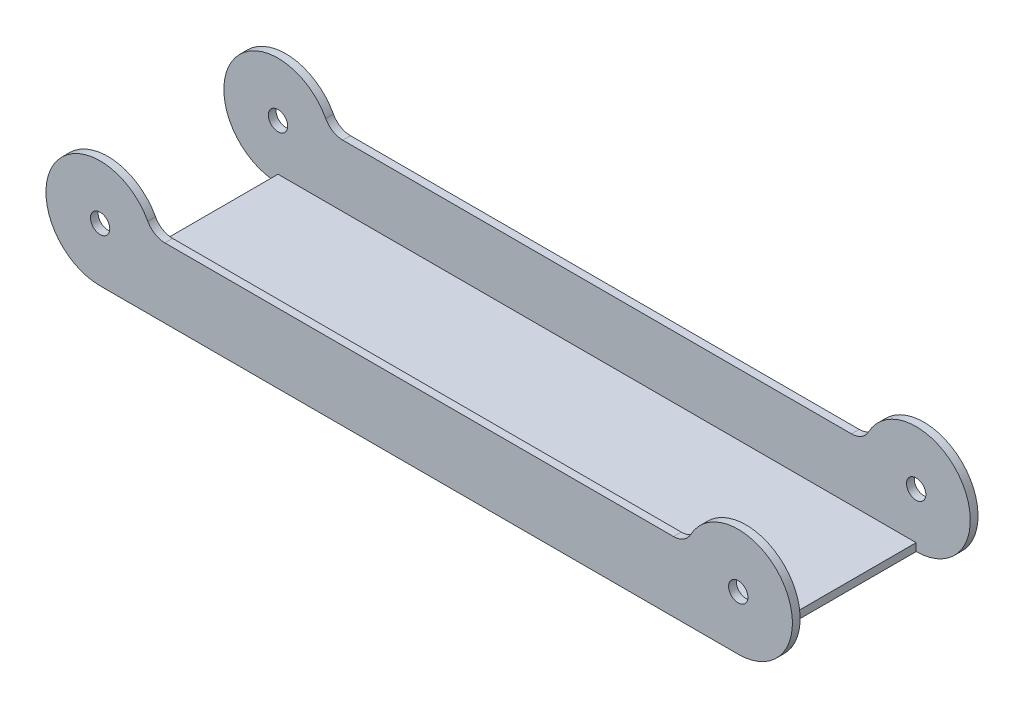
ISO-10303-21;
HEADER;
FILE_DESCRIPTION(('STEP AP214'),'2;1');
FILE_NAME('part.step','',(''),(''),'','','');
FILE_SCHEMA(('AUTOMOTIVE_DESIGN { 1 0 10303 214 1 1 1 1 }'));
ENDSEC;
DATA;
#1=APPLICATION_CONTEXT('core data for automotive mechanical design processes');
#2=APPLICATION_PROTOCOL_DEFINITION('international standard','automotive_design',2000,#1);
#3=PRODUCT_CONTEXT('',#1,'mechanical');
#4=PRODUCT('Part','Part','',(#3));
#5=PRODUCT_RELATED_PRODUCT_CATEGORY('part','',(#4));
#6=PRODUCT_DEFINITION_FORMATION('','',#4);
#7=PRODUCT_DEFINITION_CONTEXT('part definition',#1,'design');
#8=PRODUCT_DEFINITION('design','',#6,#7);
#9=PRODUCT_DEFINITION_SHAPE('','',#8);
#10=(LENGTH_UNIT() NAMED_UNIT(*) SI_UNIT(.MILLI.,.METRE.));
#11=(NAMED_UNIT(*) PLANE_ANGLE_UNIT() SI_UNIT($,.RADIAN.));
#12=(NAMED_UNIT(*) SI_UNIT($,.STERADIAN.) SOLID_ANGLE_UNIT());
#13=UNCERTAINTY_MEASURE_WITH_UNIT(LENGTH_MEASURE(1.E-05),#10,'distance_accuracy_value','');
#14=(GEOMETRIC_REPRESENTATION_CONTEXT(3) GLOBAL_UNCERTAINTY_ASSIGNED_CONTEXT((#13)) GLOBAL_UNIT_ASSIGNED_CONTEXT((#10,
#11,#12)) REPRESENTATION_CONTEXT('',''));
#15=CARTESIAN_POINT('',(0.,0.,0.));
#16=DIRECTION('',(0.,0.,1.));
#17=DIRECTION('',(1.,0.,0.));
#18=AXIS2_PLACEMENT_3D('',#15,#16,#17);
#19=CARTESIAN_POINT('',(82.5,0.,-24.));
#20=DIRECTION('',(0.,0.,1.));
#21=DIRECTION('',(1.,0.,0.));
#22=AXIS2_PLACEMENT_3D('',#19,#20,#21);
#23=CYLINDRICAL_SURFACE('',#22,14.);
#24=CARTESIAN_POINT('',(82.5,0.,-24.));
#25=DIRECTION('',(0.,0.,-1.));
#26=DIRECTION('',(1.,0.,0.));
#27=AXIS2_PLACEMENT_3D('',#24,#25,#26);
#28=CIRCLE('',#27,14.);
#29=CARTESIAN_POINT('',(70.170273293182,6.63157894736842,-24.));
#30=VERTEX_POINT('',#29);
#31=CARTESIAN_POINT('',(82.5,-14.,-24.));
#32=VERTEX_POINT('',#31);
#33=EDGE_CURVE('E276',#30,#32,#28,.T.);
#34=ORIENTED_EDGE('',*,*,#33,.F.);
#35=DIRECTION('',(0.,0.,1.));
#36=VECTOR('',#35,1.);
#37=CARTESIAN_POINT('',(70.170273293182,6.63157894736842,-24.));
#38=LINE('',#37,#36);
#39=CARTESIAN_POINT('',(70.170273293182,6.63157894736842,-22.));
#40=VERTEX_POINT('',#39);
#41=EDGE_CURVE('E139',#30,#40,#38,.T.);
#42=ORIENTED_EDGE('',*,*,#41,.T.);
#43=CARTESIAN_POINT('',(82.5,0.,-22.));
#44=DIRECTION('',(0.,0.,1.));
#45=DIRECTION('',(1.,0.,0.));
#46=AXIS2_PLACEMENT_3D('',#43,#44,#45);
#47=CIRCLE('',#46,14.);
#48=CARTESIAN_POINT('',(82.5,-14.,-22.));
#49=VERTEX_POINT('',#48);
#50=EDGE_CURVE('E132',#40,#49,#47,.F.);
#51=ORIENTED_EDGE('',*,*,#50,.T.);
#52=DIRECTION('',(0.,0.,1.));
#53=VECTOR('',#52,1.);
#54=CARTESIAN_POINT('',(82.5,-14.,-24.));
#55=LINE('',#54,#53);
#56=EDGE_CURVE('E136',#32,#49,#55,.T.);
#57=ORIENTED_EDGE('',*,*,#56,.F.);
#58=EDGE_LOOP('',(#34,#42,#51,#57));
#59=FACE_BOUND('',#58,.T.);
#60=ADVANCED_FACE('F32',(#59),#23,.T.);
#61=CARTESIAN_POINT('',(-82.5,0.,-24.));
#62=DIRECTION('',(0.,0.,1.));
#63=DIRECTION('',(1.,0.,0.));
#64=AXIS2_PLACEMENT_3D('',#61,#62,#63);
#65=CYLINDRICAL_SURFACE('',#64,14.);
#66=CARTESIAN_POINT('',(-82.5,0.,24.));
#67=DIRECTION('',(0.,0.,-1.));
#68=DIRECTION('',(1.,0.,0.));
#69=AXIS2_PLACEMENT_3D('',#66,#67,#68);
#70=CIRCLE('',#69,14.);
#71=CARTESIAN_POINT('',(-82.5,-14.,24.));
#72=VERTEX_POINT('',#71);
#73=CARTESIAN_POINT('',(-70.170273293182,6.63157894736842,24.));
#74=VERTEX_POINT('',#73);
#75=EDGE_CURVE('E269',#72,#74,#70,.T.);
#76=ORIENTED_EDGE('',*,*,#75,.T.);
#77=DIRECTION('',(0.,0.,1.));
#78=VECTOR('',#77,1.);
#79=CARTESIAN_POINT('',(-70.170273293182,6.63157894736842,-24.));
#80=LINE('',#79,#78);
#81=CARTESIAN_POINT('',(-70.170273293182,6.63157894736842,22.));
#82=VERTEX_POINT('',#81);
#83=EDGE_CURVE('E234',#74,#82,#80,.F.);
#84=ORIENTED_EDGE('',*,*,#83,.T.);
#85=CARTESIAN_POINT('',(-82.5,0.,22.));
#86=DIRECTION('',(0.,0.,-1.));
#87=DIRECTION('',(-1.,0.,0.));
#88=AXIS2_PLACEMENT_3D('',#85,#86,#87);
#89=CIRCLE('',#88,14.);
#90=CARTESIAN_POINT('',(-82.5,-14.,22.));
#91=VERTEX_POINT('',#90);
#92=EDGE_CURVE('E177',#82,#91,#89,.F.);
#93=ORIENTED_EDGE('',*,*,#92,.T.);
#94=DIRECTION('',(0.,0.,1.));
#95=VECTOR('',#94,1.);
#96=CARTESIAN_POINT('',(-82.5,-14.,-24.));
#97=LINE('',#96,#95);
#98=EDGE_CURVE('E169',#91,#72,#97,.T.);
#99=ORIENTED_EDGE('',*,*,#98,.T.);
#100=EDGE_LOOP('',(#76,#84,#93,#99));
#101=FACE_BOUND('',#100,.T.);
#102=ADVANCED_FACE('F273',(#101),#65,.T.);
#103=CARTESIAN_POINT('',(0.,-14.,0.));
#104=DIRECTION('',(0.,1.,0.));
#105=DIRECTION('',(0.,0.,1.));
#106=AXIS2_PLACEMENT_3D('',#103,#104,#105);
#107=PLANE('',#106);
#108=ORIENTED_EDGE('',*,*,#56,.T.);
#109=DIRECTION('',(0.,0.,-1.));
#110=VECTOR('',#109,1.);
#111=CARTESIAN_POINT('',(82.5,-14.,22.));
#112=LINE('',#111,#110);
#113=CARTESIAN_POINT('',(82.5,-14.,22.));
#114=VERTEX_POINT('',#113);
#115=EDGE_CURVE('E158',#114,#49,#112,.T.);
#116=ORIENTED_EDGE('',*,*,#115,.F.);
#117=CARTESIAN_POINT('',(82.5,-14.,24.));
#118=VERTEX_POINT('',#117);
#119=EDGE_CURVE('E170',#114,#118,#55,.T.);
#120=ORIENTED_EDGE('',*,*,#119,.T.);
#121=DIRECTION('',(1.,0.,0.));
#122=VECTOR('',#121,1.);
#123=CARTESIAN_POINT('',(-97.5,-14.,24.));
#124=LINE('',#123,#122);
#125=EDGE_CURVE('E210',#72,#118,#124,.T.);
#126=ORIENTED_EDGE('',*,*,#125,.F.);
#127=ORIENTED_EDGE('',*,*,#98,.F.);
#128=DIRECTION('',(0.,0.,1.));
#129=VECTOR('',#128,1.);
#130=CARTESIAN_POINT('',(-82.5,-14.,22.));
#131=LINE('',#130,#129);
#132=CARTESIAN_POINT('',(-82.5,-14.,-22.));
#133=VERTEX_POINT('',#132);
#134=EDGE_CURVE('E323',#133,#91,#131,.T.);
#135=ORIENTED_EDGE('',*,*,#134,.F.);
#136=CARTESIAN_POINT('',(-82.5,-14.,-24.));
#137=VERTEX_POINT('',#136);
#138=EDGE_CURVE('E172',#137,#133,#97,.T.);
#139=ORIENTED_EDGE('',*,*,#138,.F.);
#140=DIRECTION('',(-1.,0.,0.));
#141=VECTOR('',#140,1.);
#142=CARTESIAN_POINT('',(-97.5,-14.,-24.));
#143=LINE('',#142,#141);
#144=EDGE_CURVE('E168',#32,#137,#143,.T.);
#145=ORIENTED_EDGE('',*,*,#144,.F.);
#146=EDGE_LOOP('',(#108,#116,#120,#126,#127,#135,#139,#145));
#147=FACE_BOUND('',#146,.T.);
#148=ADVANCED_FACE('F165',(#147),#107,.F.);
#149=CARTESIAN_POINT('',(-97.5,14.,-24.));
#150=DIRECTION('',(0.,0.,1.));
#151=DIRECTION('',(1.,0.,0.));
#152=AXIS2_PLACEMENT_3D('',#149,#150,#151);
#153=PLANE('',#152);
#154=CARTESIAN_POINT('',(-82.5,0.,-24.));
#155=DIRECTION('',(0.,0.,1.));
#156=DIRECTION('',(1.,0.,0.));
#157=AXIS2_PLACEMENT_3D('',#154,#155,#156);
#158=CIRCLE('',#157,2.49999999999999);
#159=CARTESIAN_POINT('',(-80.,0.,-24.));
#160=VERTEX_POINT('',#159);
#161=EDGE_CURVE('E186',#160,#160,#158,.T.);
#162=ORIENTED_EDGE('',*,*,#161,.T.);
#163=EDGE_LOOP('',(#162));
#164=FACE_BOUND('',#163,.T.);
#165=CARTESIAN_POINT('',(82.5,0.,-24.));
#166=DIRECTION('',(0.,0.,1.));
#167=DIRECTION('',(1.,0.,0.));
#168=AXIS2_PLACEMENT_3D('',#165,#166,#167);
#169=CIRCLE('',#168,2.49999999999999);
#170=CARTESIAN_POINT('',(85.,0.,-24.));
#171=VERTEX_POINT('',#170);
#172=EDGE_CURVE('E193',#171,#171,#169,.T.);
#173=ORIENTED_EDGE('',*,*,#172,.T.);
#174=EDGE_LOOP('',(#173));
#175=FACE_BOUND('',#174,.T.);
#176=CARTESIAN_POINT('',(-82.5,0.,-24.));
#177=DIRECTION('',(0.,0.,-1.));
#178=DIRECTION('',(1.,0.,0.));
#179=AXIS2_PLACEMENT_3D('',#176,#177,#178);
#180=CIRCLE('',#179,14.);
#181=CARTESIAN_POINT('',(-70.170273293182,6.63157894736842,-24.));
#182=VERTEX_POINT('',#181);
#183=EDGE_CURVE('E282',#137,#182,#180,.T.);
#184=ORIENTED_EDGE('',*,*,#183,.T.);
#185=CARTESIAN_POINT('',(-65.7667994693185,9.,-24.));
#186=DIRECTION('',(0.,0.,1.));
#187=DIRECTION('',(1.,0.,0.));
#188=AXIS2_PLACEMENT_3D('',#185,#186,#187);
#189=CIRCLE('',#188,5.);
#190=CARTESIAN_POINT('',(-65.7667994693185,4.,-24.));
#191=VERTEX_POINT('',#190);
#192=EDGE_CURVE('E11',#182,#191,#189,.T.);
#193=ORIENTED_EDGE('',*,*,#192,.T.);
#194=DIRECTION('',(1.,0.,0.));
#195=VECTOR('',#194,1.);
#196=CARTESIAN_POINT('',(-69.0835921350013,4.,-24.));
#197=LINE('',#196,#195);
#198=CARTESIAN_POINT('',(65.7667994693185,4.,-24.));
#199=VERTEX_POINT('',#198);
#200=EDGE_CURVE('E174',#191,#199,#197,.T.);
#201=ORIENTED_EDGE('',*,*,#200,.T.);
#202=CARTESIAN_POINT('',(65.7667994693185,9.,-24.));
#203=DIRECTION('',(0.,0.,1.));
#204=DIRECTION('',(1.,0.,0.));
#205=AXIS2_PLACEMENT_3D('',#202,#203,#204);
#206=CIRCLE('',#205,5.);
#207=EDGE_CURVE('E239',#199,#30,#206,.T.);
#208=ORIENTED_EDGE('',*,*,#207,.T.);
#209=ORIENTED_EDGE('',*,*,#33,.T.);
#210=ORIENTED_EDGE('',*,*,#144,.T.);
#211=EDGE_LOOP('',(#184,#193,#201,#208,#209,#210));
#212=FACE_BOUND('',#211,.T.);
#213=ADVANCED_FACE('F287',(#164,#175,#212),#153,.F.);
#214=CARTESIAN_POINT('',(-97.5,14.,24.));
#215=DIRECTION('',(0.,0.,-1.));
#216=DIRECTION('',(-1.,0.,0.));
#217=AXIS2_PLACEMENT_3D('',#214,#215,#216);
#218=PLANE('',#217);
#219=CARTESIAN_POINT('',(-82.5,0.,24.));
#220=DIRECTION('',(0.,0.,1.));
#221=DIRECTION('',(1.,0.,0.));
#222=AXIS2_PLACEMENT_3D('',#219,#220,#221);
#223=CIRCLE('',#222,2.49999999999999);
#224=CARTESIAN_POINT('',(-80.,0.,24.));
#225=VERTEX_POINT('',#224);
#226=EDGE_CURVE('E190',#225,#225,#223,.T.);
#227=ORIENTED_EDGE('',*,*,#226,.F.);
#228=EDGE_LOOP('',(#227));
#229=FACE_BOUND('',#228,.T.);
#230=CARTESIAN_POINT('',(82.5,0.,24.));
#231=DIRECTION('',(0.,0.,1.));
#232=DIRECTION('',(1.,0.,0.));
#233=AXIS2_PLACEMENT_3D('',#230,#231,#232);
#234=CIRCLE('',#233,2.49999999999999);
#235=CARTESIAN_POINT('',(85.,0.,24.));
#236=VERTEX_POINT('',#235);
#237=EDGE_CURVE('E185',#236,#236,#234,.T.);
#238=ORIENTED_EDGE('',*,*,#237,.F.);
#239=EDGE_LOOP('',(#238));
#240=FACE_BOUND('',#239,.T.);
#241=ORIENTED_EDGE('',*,*,#125,.T.);
#242=CARTESIAN_POINT('',(82.5,0.,24.));
#243=DIRECTION('',(0.,0.,-1.));
#244=DIRECTION('',(1.,0.,0.));
#245=AXIS2_PLACEMENT_3D('',#242,#243,#244);
#246=CIRCLE('',#245,14.);
#247=CARTESIAN_POINT('',(70.170273293182,6.63157894736842,24.));
#248=VERTEX_POINT('',#247);
#249=EDGE_CURVE('E153',#248,#118,#246,.T.);
#250=ORIENTED_EDGE('',*,*,#249,.F.);
#251=CARTESIAN_POINT('',(65.7667994693185,9.,24.));
#252=DIRECTION('',(0.,0.,-1.));
#253=DIRECTION('',(-1.,0.,0.));
#254=AXIS2_PLACEMENT_3D('',#251,#252,#253);
#255=CIRCLE('',#254,5.);
#256=CARTESIAN_POINT('',(65.7667994693185,4.,24.));
#257=VERTEX_POINT('',#256);
#258=EDGE_CURVE('E241',#248,#257,#255,.T.);
#259=ORIENTED_EDGE('',*,*,#258,.T.);
#260=DIRECTION('',(1.,0.,0.));
#261=VECTOR('',#260,1.);
#262=CARTESIAN_POINT('',(-69.0835921350013,4.,24.));
#263=LINE('',#262,#261);
#264=CARTESIAN_POINT('',(-65.7667994693185,4.,24.));
#265=VERTEX_POINT('',#264);
#266=EDGE_CURVE('E271',#265,#257,#263,.T.);
#267=ORIENTED_EDGE('',*,*,#266,.F.);
#268=CARTESIAN_POINT('',(-65.7667994693185,9.,24.));
#269=DIRECTION('',(0.,0.,-1.));
#270=DIRECTION('',(-1.,0.,0.));
#271=AXIS2_PLACEMENT_3D('',#268,#269,#270);
#272=CIRCLE('',#271,5.);
#273=EDGE_CURVE('E245',#265,#74,#272,.T.);
#274=ORIENTED_EDGE('',*,*,#273,.T.);
#275=ORIENTED_EDGE('',*,*,#75,.F.);
#276=EDGE_LOOP('',(#241,#250,#259,#267,#274,#275));
#277=FACE_BOUND('',#276,.T.);
#278=ADVANCED_FACE('F268',(#229,#240,#277),#218,.F.);
#279=CARTESIAN_POINT('',(-97.5,14.,-22.));
#280=DIRECTION('',(0.,0.,1.));
#281=DIRECTION('',(1.,0.,0.));
#282=AXIS2_PLACEMENT_3D('',#279,#280,#281);
#283=PLANE('',#282);
#284=DIRECTION('',(-1.,0.,0.));
#285=VECTOR('',#284,1.);
#286=CARTESIAN_POINT('',(-97.5,-12.,-22.));
#287=LINE('',#286,#285);
#288=CARTESIAN_POINT('',(82.5,-12.,-22.));
#289=VERTEX_POINT('',#288);
#290=CARTESIAN_POINT('',(-82.5,-12.,-22.));
#291=VERTEX_POINT('',#290);
#292=EDGE_CURVE('E149',#289,#291,#287,.T.);
#293=ORIENTED_EDGE('',*,*,#292,.F.);
#294=DIRECTION('',(0.,-1.,0.));
#295=VECTOR('',#294,1.);
#296=CARTESIAN_POINT('',(82.5,14.001,-22.));
#297=LINE('',#296,#295);
#298=EDGE_CURVE('E144',#289,#49,#297,.T.);
#299=ORIENTED_EDGE('',*,*,#298,.T.);
#300=ORIENTED_EDGE('',*,*,#50,.F.);
#301=CARTESIAN_POINT('',(65.7667994693185,9.,-22.));
#302=DIRECTION('',(0.,0.,1.));
#303=DIRECTION('',(1.,0.,0.));
#304=AXIS2_PLACEMENT_3D('',#301,#302,#303);
#305=CIRCLE('',#304,5.);
#306=CARTESIAN_POINT('',(65.7667994693185,4.,-22.));
#307=VERTEX_POINT('',#306);
#308=EDGE_CURVE('E237',#40,#307,#305,.F.);
#309=ORIENTED_EDGE('',*,*,#308,.T.);
#310=DIRECTION('',(1.,0.,0.));
#311=VECTOR('',#310,1.);
#312=CARTESIAN_POINT('',(-97.5,4.,-22.));
#313=LINE('',#312,#311);
#314=CARTESIAN_POINT('',(-65.7667994693185,4.,-22.));
#315=VERTEX_POINT('',#314);
#316=EDGE_CURVE('E140',#315,#307,#313,.T.);
#317=ORIENTED_EDGE('',*,*,#316,.F.);
#318=CARTESIAN_POINT('',(-65.7667994693185,9.,-22.));
#319=DIRECTION('',(0.,0.,1.));
#320=DIRECTION('',(1.,0.,0.));
#321=AXIS2_PLACEMENT_3D('',#318,#319,#320);
#322=CIRCLE('',#321,5.);
#323=CARTESIAN_POINT('',(-70.170273293182,6.63157894736842,-22.));
#324=VERTEX_POINT('',#323);
#325=EDGE_CURVE('E40',#315,#324,#322,.F.);
#326=ORIENTED_EDGE('',*,*,#325,.T.);
#327=CARTESIAN_POINT('',(-82.5,0.,-22.));
#328=DIRECTION('',(0.,0.,1.));
#329=DIRECTION('',(1.,0.,0.));
#330=AXIS2_PLACEMENT_3D('',#327,#328,#329);
#331=CIRCLE('',#330,14.);
#332=EDGE_CURVE('E179',#133,#324,#331,.F.);
#333=ORIENTED_EDGE('',*,*,#332,.F.);
#334=DIRECTION('',(0.,-1.,0.));
#335=VECTOR('',#334,1.);
#336=CARTESIAN_POINT('',(-82.5,14.001,-22.));
#337=LINE('',#336,#335);
#338=EDGE_CURVE('E327',#291,#133,#337,.T.);
#339=ORIENTED_EDGE('',*,*,#338,.F.);
#340=EDGE_LOOP('',(#293,#299,#300,#309,#317,#326,#333,#339));
#341=FACE_BOUND('',#340,.T.);
#342=CARTESIAN_POINT('',(-82.5,0.,-22.));
#343=DIRECTION('',(0.,0.,1.));
#344=DIRECTION('',(1.,0.,0.));
#345=AXIS2_PLACEMENT_3D('',#342,#343,#344);
#346=CIRCLE('',#345,2.49999999999999);
#347=CARTESIAN_POINT('',(-80.,0.,-22.));
#348=VERTEX_POINT('',#347);
#349=EDGE_CURVE('E202',#348,#348,#346,.T.);
#350=ORIENTED_EDGE('',*,*,#349,.F.);
#351=EDGE_LOOP('',(#350));
#352=FACE_BOUND('',#351,.T.);
#353=CARTESIAN_POINT('',(82.5,0.,-22.));
#354=DIRECTION('',(0.,0.,1.));
#355=DIRECTION('',(1.,0.,0.));
#356=AXIS2_PLACEMENT_3D('',#353,#354,#355);
#357=CIRCLE('',#356,2.49999999999999);
#358=CARTESIAN_POINT('',(85.,0.,-22.));
#359=VERTEX_POINT('',#358);
#360=EDGE_CURVE('E198',#359,#359,#357,.T.);
#361=ORIENTED_EDGE('',*,*,#360,.F.);
#362=EDGE_LOOP('',(#361));
#363=FACE_BOUND('',#362,.T.);
#364=ADVANCED_FACE('F146',(#341,#352,#363),#283,.T.);
#365=CARTESIAN_POINT('',(-97.5,14.,22.));
#366=DIRECTION('',(0.,0.,-1.));
#367=DIRECTION('',(-1.,0.,0.));
#368=AXIS2_PLACEMENT_3D('',#365,#366,#367);
#369=PLANE('',#368);
#370=CARTESIAN_POINT('',(82.5,0.,22.));
#371=DIRECTION('',(0.,0.,-1.));
#372=DIRECTION('',(-1.,0.,0.));
#373=AXIS2_PLACEMENT_3D('',#370,#371,#372);
#374=CIRCLE('',#373,14.);
#375=CARTESIAN_POINT('',(70.170273293182,6.63157894736842,22.));
#376=VERTEX_POINT('',#375);
#377=EDGE_CURVE('E141',#114,#376,#374,.F.);
#378=ORIENTED_EDGE('',*,*,#377,.F.);
#379=DIRECTION('',(0.,-1.,0.));
#380=VECTOR('',#379,1.);
#381=CARTESIAN_POINT('',(82.5,14.001,22.));
#382=LINE('',#381,#380);
#383=CARTESIAN_POINT('',(82.5,-12.,22.));
#384=VERTEX_POINT('',#383);
#385=EDGE_CURVE('E154',#384,#114,#382,.T.);
#386=ORIENTED_EDGE('',*,*,#385,.F.);
#387=DIRECTION('',(1.,0.,0.));
#388=VECTOR('',#387,1.);
#389=CARTESIAN_POINT('',(-97.5,-12.,22.));
#390=LINE('',#389,#388);
#391=CARTESIAN_POINT('',(-82.5,-12.,22.));
#392=VERTEX_POINT('',#391);
#393=EDGE_CURVE('E206',#392,#384,#390,.T.);
#394=ORIENTED_EDGE('',*,*,#393,.F.);
#395=DIRECTION('',(0.,-1.,0.));
#396=VECTOR('',#395,1.);
#397=CARTESIAN_POINT('',(-82.5,14.001,22.));
#398=LINE('',#397,#396);
#399=EDGE_CURVE('E333',#392,#91,#398,.T.);
#400=ORIENTED_EDGE('',*,*,#399,.T.);
#401=ORIENTED_EDGE('',*,*,#92,.F.);
#402=CARTESIAN_POINT('',(-65.7667994693185,9.,22.));
#403=DIRECTION('',(0.,0.,-1.));
#404=DIRECTION('',(-1.,0.,0.));
#405=AXIS2_PLACEMENT_3D('',#402,#403,#404);
#406=CIRCLE('',#405,5.);
#407=CARTESIAN_POINT('',(-65.7667994693185,4.,22.));
#408=VERTEX_POINT('',#407);
#409=EDGE_CURVE('E247',#82,#408,#406,.F.);
#410=ORIENTED_EDGE('',*,*,#409,.T.);
#411=DIRECTION('',(-1.,0.,0.));
#412=VECTOR('',#411,1.);
#413=CARTESIAN_POINT('',(-97.5,4.,22.));
#414=LINE('',#413,#412);
#415=CARTESIAN_POINT('',(65.7667994693185,4.,22.));
#416=VERTEX_POINT('',#415);
#417=EDGE_CURVE('E213',#416,#408,#414,.T.);
#418=ORIENTED_EDGE('',*,*,#417,.F.);
#419=CARTESIAN_POINT('',(65.7667994693185,9.,22.));
#420=DIRECTION('',(0.,0.,-1.));
#421=DIRECTION('',(-1.,0.,0.));
#422=AXIS2_PLACEMENT_3D('',#419,#420,#421);
#423=CIRCLE('',#422,5.);
#424=EDGE_CURVE('E243',#416,#376,#423,.F.);
#425=ORIENTED_EDGE('',*,*,#424,.T.);
#426=EDGE_LOOP('',(#378,#386,#394,#400,#401,#410,#418,#425));
#427=FACE_BOUND('',#426,.T.);
#428=CARTESIAN_POINT('',(-82.5,0.,22.));
#429=DIRECTION('',(0.,0.,-1.));
#430=DIRECTION('',(-1.,0.,0.));
#431=AXIS2_PLACEMENT_3D('',#428,#429,#430);
#432=CIRCLE('',#431,2.49999999999999);
#433=CARTESIAN_POINT('',(-85.,0.,22.));
#434=VERTEX_POINT('',#433);
#435=EDGE_CURVE('E201',#434,#434,#432,.T.);
#436=ORIENTED_EDGE('',*,*,#435,.F.);
#437=EDGE_LOOP('',(#436));
#438=FACE_BOUND('',#437,.T.);
#439=CARTESIAN_POINT('',(82.5,0.,22.));
#440=DIRECTION('',(0.,0.,-1.));
#441=DIRECTION('',(-1.,0.,0.));
#442=AXIS2_PLACEMENT_3D('',#439,#440,#441);
#443=CIRCLE('',#442,2.49999999999999);
#444=CARTESIAN_POINT('',(80.,0.,22.));
#445=VERTEX_POINT('',#444);
#446=EDGE_CURVE('E189',#445,#445,#443,.T.);
#447=ORIENTED_EDGE('',*,*,#446,.F.);
#448=EDGE_LOOP('',(#447));
#449=FACE_BOUND('',#448,.T.);
#450=ADVANCED_FACE('F252',(#427,#438,#449),#369,.T.);
#451=CARTESIAN_POINT('',(0.,-12.,0.));
#452=DIRECTION('',(0.,1.,0.));
#453=DIRECTION('',(0.,0.,1.));
#454=AXIS2_PLACEMENT_3D('',#451,#452,#453);
#455=PLANE('',#454);
#456=DIRECTION('',(0.,0.,-1.));
#457=VECTOR('',#456,1.);
#458=CARTESIAN_POINT('',(82.5,-12.,22.));
#459=LINE('',#458,#457);
#460=EDGE_CURVE('E163',#384,#289,#459,.T.);
#461=ORIENTED_EDGE('',*,*,#460,.T.);
#462=ORIENTED_EDGE('',*,*,#292,.T.);
#463=DIRECTION('',(0.,0.,1.));
#464=VECTOR('',#463,1.);
#465=CARTESIAN_POINT('',(-82.5,-12.,22.));
#466=LINE('',#465,#464);
#467=EDGE_CURVE('E328',#291,#392,#466,.T.);
#468=ORIENTED_EDGE('',*,*,#467,.T.);
#469=ORIENTED_EDGE('',*,*,#393,.T.);
#470=EDGE_LOOP('',(#461,#462,#468,#469));
#471=FACE_BOUND('',#470,.T.);
#472=ADVANCED_FACE('F339',(#471),#455,.T.);
#473=CARTESIAN_POINT('',(82.5,0.,-24.));
#474=DIRECTION('',(0.,0.,1.));
#475=DIRECTION('',(1.,0.,0.));
#476=AXIS2_PLACEMENT_3D('',#473,#474,#475);
#477=CYLINDRICAL_SURFACE('',#476,2.49999999999999);
#478=ORIENTED_EDGE('',*,*,#446,.T.);
#479=EDGE_LOOP('',(#478));
#480=FACE_BOUND('',#479,.T.);
#481=ORIENTED_EDGE('',*,*,#237,.T.);
#482=EDGE_LOOP('',(#481));
#483=FACE_BOUND('',#482,.T.);
#484=ADVANCED_FACE('F342',(#480,#483),#477,.F.);
#485=CARTESIAN_POINT('',(-82.5,0.,-24.));
#486=DIRECTION('',(0.,0.,1.));
#487=DIRECTION('',(1.,0.,0.));
#488=AXIS2_PLACEMENT_3D('',#485,#486,#487);
#489=CYLINDRICAL_SURFACE('',#488,2.49999999999999);
#490=ORIENTED_EDGE('',*,*,#435,.T.);
#491=EDGE_LOOP('',(#490));
#492=FACE_BOUND('',#491,.T.);
#493=ORIENTED_EDGE('',*,*,#226,.T.);
#494=EDGE_LOOP('',(#493));
#495=FACE_BOUND('',#494,.T.);
#496=ADVANCED_FACE('F348',(#492,#495),#489,.F.);
#497=ORIENTED_EDGE('',*,*,#360,.T.);
#498=EDGE_LOOP('',(#497));
#499=FACE_BOUND('',#498,.T.);
#500=ORIENTED_EDGE('',*,*,#172,.F.);
#501=EDGE_LOOP('',(#500));
#502=FACE_BOUND('',#501,.T.);
#503=ADVANCED_FACE('F351',(#499,#502),#477,.F.);
#504=ORIENTED_EDGE('',*,*,#349,.T.);
#505=EDGE_LOOP('',(#504));
#506=FACE_BOUND('',#505,.T.);
#507=ORIENTED_EDGE('',*,*,#161,.F.);
#508=EDGE_LOOP('',(#507));
#509=FACE_BOUND('',#508,.T.);
#510=ADVANCED_FACE('F316',(#506,#509),#489,.F.);
#511=CARTESIAN_POINT('',(-69.0835921350013,4.,-24.));
#512=DIRECTION('',(0.,-1.,0.));
#513=DIRECTION('',(0.,0.,-1.));
#514=AXIS2_PLACEMENT_3D('',#511,#512,#513);
#515=PLANE('',#514);
#516=ORIENTED_EDGE('',*,*,#316,.T.);
#517=DIRECTION('',(0.,0.,-1.));
#518=VECTOR('',#517,1.);
#519=CARTESIAN_POINT('',(65.7667994693185,4.,-24.));
#520=LINE('',#519,#518);
#521=EDGE_CURVE('E224',#307,#199,#520,.T.);
#522=ORIENTED_EDGE('',*,*,#521,.T.);
#523=ORIENTED_EDGE('',*,*,#200,.F.);
#524=DIRECTION('',(0.,0.,-1.));
#525=VECTOR('',#524,1.);
#526=CARTESIAN_POINT('',(-65.7667994693185,4.,-22.));
#527=LINE('',#526,#525);
#528=EDGE_CURVE('E221',#191,#315,#527,.F.);
#529=ORIENTED_EDGE('',*,*,#528,.T.);
#530=EDGE_LOOP('',(#516,#522,#523,#529));
#531=FACE_BOUND('',#530,.T.);
#532=ADVANCED_FACE('F294',(#531),#515,.F.);
#533=ORIENTED_EDGE('',*,*,#377,.T.);
#534=DIRECTION('',(0.,0.,1.));
#535=VECTOR('',#534,1.);
#536=CARTESIAN_POINT('',(70.170273293182,6.63157894736842,-24.));
#537=LINE('',#536,#535);
#538=EDGE_CURVE('E226',#376,#248,#537,.T.);
#539=ORIENTED_EDGE('',*,*,#538,.T.);
#540=ORIENTED_EDGE('',*,*,#249,.T.);
#541=ORIENTED_EDGE('',*,*,#119,.F.);
#542=EDGE_LOOP('',(#533,#539,#540,#541));
#543=FACE_BOUND('',#542,.T.);
#544=ADVANCED_FACE('F303',(#543),#23,.T.);
#545=ORIENTED_EDGE('',*,*,#332,.T.);
#546=DIRECTION('',(0.,0.,1.));
#547=VECTOR('',#546,1.);
#548=CARTESIAN_POINT('',(-70.170273293182,6.63157894736842,-24.));
#549=LINE('',#548,#547);
#550=EDGE_CURVE('E47',#324,#182,#549,.F.);
#551=ORIENTED_EDGE('',*,*,#550,.T.);
#552=ORIENTED_EDGE('',*,*,#183,.F.);
#553=ORIENTED_EDGE('',*,*,#138,.T.);
#554=EDGE_LOOP('',(#545,#551,#552,#553));
#555=FACE_BOUND('',#554,.T.);
#556=ADVANCED_FACE('F308',(#555),#65,.T.);
#557=ORIENTED_EDGE('',*,*,#266,.T.);
#558=DIRECTION('',(0.,0.,-1.));
#559=VECTOR('',#558,1.);
#560=CARTESIAN_POINT('',(65.7667994693185,4.,22.));
#561=LINE('',#560,#559);
#562=EDGE_CURVE('E232',#257,#416,#561,.T.);
#563=ORIENTED_EDGE('',*,*,#562,.T.);
#564=ORIENTED_EDGE('',*,*,#417,.T.);
#565=DIRECTION('',(0.,0.,-1.));
#566=VECTOR('',#565,1.);
#567=CARTESIAN_POINT('',(-65.7667994693185,4.,24.));
#568=LINE('',#567,#566);
#569=EDGE_CURVE('E229',#408,#265,#568,.F.);
#570=ORIENTED_EDGE('',*,*,#569,.T.);
#571=EDGE_LOOP('',(#557,#563,#564,#570));
#572=FACE_BOUND('',#571,.T.);
#573=ADVANCED_FACE('F261',(#572),#515,.F.);
#574=CARTESIAN_POINT('',(-82.5,14.001,22.));
#575=DIRECTION('',(1.,0.,0.));
#576=DIRECTION('',(0.,0.,-1.));
#577=AXIS2_PLACEMENT_3D('',#574,#575,#576);
#578=PLANE('',#577);
#579=ORIENTED_EDGE('',*,*,#338,.T.);
#580=ORIENTED_EDGE('',*,*,#134,.T.);
#581=ORIENTED_EDGE('',*,*,#399,.F.);
#582=ORIENTED_EDGE('',*,*,#467,.F.);
#583=EDGE_LOOP('',(#579,#580,#581,#582));
#584=FACE_BOUND('',#583,.T.);
#585=ADVANCED_FACE('F331',(#584),#578,.F.);
#586=CARTESIAN_POINT('',(82.5,14.001,22.));
#587=DIRECTION('',(-1.,0.,0.));
#588=DIRECTION('',(0.,0.,1.));
#589=AXIS2_PLACEMENT_3D('',#586,#587,#588);
#590=PLANE('',#589);
#591=ORIENTED_EDGE('',*,*,#385,.T.);
#592=ORIENTED_EDGE('',*,*,#115,.T.);
#593=ORIENTED_EDGE('',*,*,#298,.F.);
#594=ORIENTED_EDGE('',*,*,#460,.F.);
#595=EDGE_LOOP('',(#591,#592,#593,#594));
#596=FACE_BOUND('',#595,.T.);
#597=ADVANCED_FACE('F159',(#596),#590,.F.);
#598=CARTESIAN_POINT('',(65.7667994693185,9.,-24.));
#599=DIRECTION('',(0.,0.,1.));
#600=DIRECTION('',(1.,0.,0.));
#601=AXIS2_PLACEMENT_3D('',#598,#599,#600);
#602=CYLINDRICAL_SURFACE('',#601,5.);
#603=ORIENTED_EDGE('',*,*,#207,.F.);
#604=ORIENTED_EDGE('',*,*,#521,.F.);
#605=ORIENTED_EDGE('',*,*,#308,.F.);
#606=ORIENTED_EDGE('',*,*,#41,.F.);
#607=EDGE_LOOP('',(#603,#604,#605,#606));
#608=FACE_BOUND('',#607,.T.);
#609=ADVANCED_FACE('F293',(#608),#602,.F.);
#610=CARTESIAN_POINT('',(65.7667994693185,9.,-24.));
#611=DIRECTION('',(0.,0.,1.));
#612=DIRECTION('',(1.,0.,0.));
#613=AXIS2_PLACEMENT_3D('',#610,#611,#612);
#614=CYLINDRICAL_SURFACE('',#613,5.);
#615=ORIENTED_EDGE('',*,*,#424,.F.);
#616=ORIENTED_EDGE('',*,*,#562,.F.);
#617=ORIENTED_EDGE('',*,*,#258,.F.);
#618=ORIENTED_EDGE('',*,*,#538,.F.);
#619=EDGE_LOOP('',(#615,#616,#617,#618));
#620=FACE_BOUND('',#619,.T.);
#621=ADVANCED_FACE('F300',(#620),#614,.F.);
#622=CARTESIAN_POINT('',(-65.7667994693185,9.,-24.));
#623=DIRECTION('',(0.,0.,1.));
#624=DIRECTION('',(1.,0.,0.));
#625=AXIS2_PLACEMENT_3D('',#622,#623,#624);
#626=CYLINDRICAL_SURFACE('',#625,5.);
#627=ORIENTED_EDGE('',*,*,#409,.F.);
#628=ORIENTED_EDGE('',*,*,#83,.F.);
#629=ORIENTED_EDGE('',*,*,#273,.F.);
#630=ORIENTED_EDGE('',*,*,#569,.F.);
#631=EDGE_LOOP('',(#627,#628,#629,#630));
#632=FACE_BOUND('',#631,.T.);
#633=ADVANCED_FACE('F264',(#632),#626,.F.);
#634=CARTESIAN_POINT('',(-65.7667994693185,9.,-24.));
#635=DIRECTION('',(0.,0.,1.));
#636=DIRECTION('',(1.,0.,0.));
#637=AXIS2_PLACEMENT_3D('',#634,#635,#636);
#638=CYLINDRICAL_SURFACE('',#637,5.);
#639=ORIENTED_EDGE('',*,*,#192,.F.);
#640=ORIENTED_EDGE('',*,*,#550,.F.);
#641=ORIENTED_EDGE('',*,*,#325,.F.);
#642=ORIENTED_EDGE('',*,*,#528,.F.);
#643=EDGE_LOOP('',(#639,#640,#641,#642));
#644=FACE_BOUND('',#643,.T.);
#645=ADVANCED_FACE('F34',(#644),#638,.F.);
#646=CLOSED_SHELL('',(#60,#102,#148,#213,#278,#364,#450,#472,#484,#496,#503,#510,#532,#544,#556,
#573,#585,#597,#609,#621,#633,#645));
#647=MANIFOLD_SOLID_BREP('B2',#646);
#648=ADVANCED_BREP_SHAPE_REPRESENTATION('',(#18,#647),#14);
#649=SHAPE_DEFINITION_REPRESENTATION(#9,#648);
ENDSEC;
END-ISO-10303-21;
